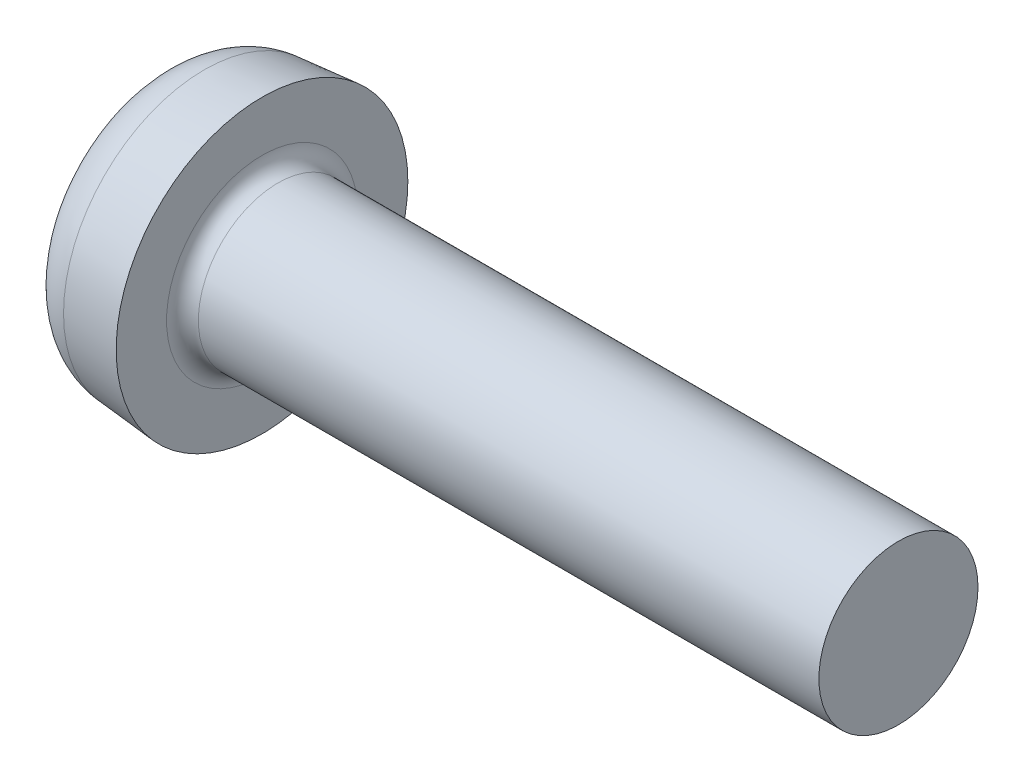
ISO-10303-21;
HEADER;
FILE_DESCRIPTION(('STEP AP214'),'2;1');
FILE_NAME('part.step','',(''),(''),'','','');
FILE_SCHEMA(('AUTOMOTIVE_DESIGN { 1 0 10303 214 1 1 1 1 }'));
ENDSEC;
DATA;
#1=APPLICATION_CONTEXT('core data for automotive mechanical design processes');
#2=APPLICATION_PROTOCOL_DEFINITION('international standard','automotive_design',2000,#1);
#3=PRODUCT_CONTEXT('',#1,'mechanical');
#4=PRODUCT('Part','Part','',(#3));
#5=PRODUCT_RELATED_PRODUCT_CATEGORY('part','',(#4));
#6=PRODUCT_DEFINITION_FORMATION('','',#4);
#7=PRODUCT_DEFINITION_CONTEXT('part definition',#1,'design');
#8=PRODUCT_DEFINITION('design','',#6,#7);
#9=PRODUCT_DEFINITION_SHAPE('','',#8);
#10=(LENGTH_UNIT() NAMED_UNIT(*) SI_UNIT(.MILLI.,.METRE.));
#11=(NAMED_UNIT(*) PLANE_ANGLE_UNIT() SI_UNIT($,.RADIAN.));
#12=(NAMED_UNIT(*) SI_UNIT($,.STERADIAN.) SOLID_ANGLE_UNIT());
#13=UNCERTAINTY_MEASURE_WITH_UNIT(LENGTH_MEASURE(1.E-05),#10,'distance_accuracy_value','');
#14=(GEOMETRIC_REPRESENTATION_CONTEXT(3) GLOBAL_UNCERTAINTY_ASSIGNED_CONTEXT((#13)) GLOBAL_UNIT_ASSIGNED_CONTEXT((#10,
#11,#12)) REPRESENTATION_CONTEXT('',''));
#15=CARTESIAN_POINT('',(0.,0.,0.));
#16=DIRECTION('',(0.,0.,1.));
#17=DIRECTION('',(1.,0.,0.));
#18=AXIS2_PLACEMENT_3D('',#15,#16,#17);
#19=CARTESIAN_POINT('',(0.,0.,0.));
#20=DIRECTION('',(-1.,0.,0.));
#21=DIRECTION('',(0.,0.,1.));
#22=AXIS2_PLACEMENT_3D('',#19,#20,#21);
#23=PLANE('',#22);
#24=DIRECTION('',(0.,1.,0.));
#25=VECTOR('',#24,1.);
#26=CARTESIAN_POINT('',(0.,0.35,-0.35));
#27=LINE('',#26,#25);
#28=CARTESIAN_POINT('',(0.,0.65,-0.35));
#29=VERTEX_POINT('',#28);
#30=CARTESIAN_POINT('',(0.,1.62134434609834,-0.35));
#31=VERTEX_POINT('',#30);
#32=EDGE_CURVE('E346',#29,#31,#27,.T.);
#33=ORIENTED_EDGE('',*,*,#32,.T.);
#34=CARTESIAN_POINT('',(0.,0.,0.));
#35=DIRECTION('',(-1.,0.,0.));
#36=DIRECTION('',(0.,0.,1.));
#37=AXIS2_PLACEMENT_3D('',#34,#35,#36);
#38=CIRCLE('',#37,1.65869149893072);
#39=CARTESIAN_POINT('',(0.,0.35,-1.62134434609834));
#40=VERTEX_POINT('',#39);
#41=EDGE_CURVE('E311',#31,#40,#38,.T.);
#42=ORIENTED_EDGE('',*,*,#41,.T.);
#43=DIRECTION('',(0.,0.,1.));
#44=VECTOR('',#43,1.);
#45=CARTESIAN_POINT('',(0.,0.35,-0.35));
#46=LINE('',#45,#44);
#47=CARTESIAN_POINT('',(0.,0.35,-0.65));
#48=VERTEX_POINT('',#47);
#49=EDGE_CURVE('E324',#40,#48,#46,.T.);
#50=ORIENTED_EDGE('',*,*,#49,.T.);
#51=CARTESIAN_POINT('',(0.,0.65,-0.65));
#52=DIRECTION('',(-1.,0.,0.));
#53=DIRECTION('',(0.,0.,1.));
#54=AXIS2_PLACEMENT_3D('',#51,#52,#53);
#55=CIRCLE('',#54,0.3);
#56=EDGE_CURVE('E373',#48,#29,#55,.T.);
#57=ORIENTED_EDGE('',*,*,#56,.T.);
#58=EDGE_LOOP('',(#33,#42,#50,#57));
#59=FACE_BOUND('',#58,.T.);
#60=ADVANCED_FACE('F41',(#59),#23,.T.);
#61=DIRECTION('',(0.,0.,-1.));
#62=VECTOR('',#61,1.);
#63=CARTESIAN_POINT('',(0.,-0.35,-0.35));
#64=LINE('',#63,#62);
#65=CARTESIAN_POINT('',(0.,-0.35,-0.65));
#66=VERTEX_POINT('',#65);
#67=CARTESIAN_POINT('',(0.,-0.35,-1.62134434609834));
#68=VERTEX_POINT('',#67);
#69=EDGE_CURVE('E339',#66,#68,#64,.T.);
#70=ORIENTED_EDGE('',*,*,#69,.T.);
#71=CARTESIAN_POINT('',(0.,0.,0.));
#72=DIRECTION('',(-1.,0.,0.));
#73=DIRECTION('',(0.,0.,1.));
#74=AXIS2_PLACEMENT_3D('',#71,#72,#73);
#75=CIRCLE('',#74,1.65869149893072);
#76=CARTESIAN_POINT('',(0.,-1.62134434609834,-0.35));
#77=VERTEX_POINT('',#76);
#78=EDGE_CURVE('E303',#68,#77,#75,.T.);
#79=ORIENTED_EDGE('',*,*,#78,.T.);
#80=DIRECTION('',(0.,1.,0.));
#81=VECTOR('',#80,1.);
#82=CARTESIAN_POINT('',(0.,-0.35,-0.35));
#83=LINE('',#82,#81);
#84=CARTESIAN_POINT('',(0.,-0.65,-0.35));
#85=VERTEX_POINT('',#84);
#86=EDGE_CURVE('E116',#77,#85,#83,.T.);
#87=ORIENTED_EDGE('',*,*,#86,.T.);
#88=CARTESIAN_POINT('',(0.,-0.65,-0.65));
#89=DIRECTION('',(-1.,0.,0.));
#90=DIRECTION('',(0.,0.,1.));
#91=AXIS2_PLACEMENT_3D('',#88,#89,#90);
#92=CIRCLE('',#91,0.3);
#93=EDGE_CURVE('E344',#85,#66,#92,.T.);
#94=ORIENTED_EDGE('',*,*,#93,.T.);
#95=EDGE_LOOP('',(#70,#79,#87,#94));
#96=FACE_BOUND('',#95,.T.);
#97=ADVANCED_FACE('F254',(#96),#23,.T.);
#98=DIRECTION('',(0.,-1.,0.));
#99=VECTOR('',#98,1.);
#100=CARTESIAN_POINT('',(0.,-0.35,0.35));
#101=LINE('',#100,#99);
#102=CARTESIAN_POINT('',(0.,-0.65,0.35));
#103=VERTEX_POINT('',#102);
#104=CARTESIAN_POINT('',(0.,-1.62134434609834,0.349999999999999));
#105=VERTEX_POINT('',#104);
#106=EDGE_CURVE('E348',#103,#105,#101,.T.);
#107=ORIENTED_EDGE('',*,*,#106,.T.);
#108=CARTESIAN_POINT('',(0.,0.,0.));
#109=DIRECTION('',(-1.,0.,0.));
#110=DIRECTION('',(0.,0.,1.));
#111=AXIS2_PLACEMENT_3D('',#108,#109,#110);
#112=CIRCLE('',#111,1.65869149893072);
#113=CARTESIAN_POINT('',(0.,-0.35,1.62134434609834));
#114=VERTEX_POINT('',#113);
#115=EDGE_CURVE('E299',#105,#114,#112,.T.);
#116=ORIENTED_EDGE('',*,*,#115,.T.);
#117=DIRECTION('',(0.,0.,-1.));
#118=VECTOR('',#117,1.);
#119=CARTESIAN_POINT('',(0.,-0.35,0.35));
#120=LINE('',#119,#118);
#121=CARTESIAN_POINT('',(0.,-0.35,0.65));
#122=VERTEX_POINT('',#121);
#123=EDGE_CURVE('E294',#114,#122,#120,.T.);
#124=ORIENTED_EDGE('',*,*,#123,.T.);
#125=CARTESIAN_POINT('',(0.,-0.65,0.65));
#126=DIRECTION('',(-1.,0.,0.));
#127=DIRECTION('',(0.,0.,1.));
#128=AXIS2_PLACEMENT_3D('',#125,#126,#127);
#129=CIRCLE('',#128,0.3);
#130=EDGE_CURVE('E378',#122,#103,#129,.T.);
#131=ORIENTED_EDGE('',*,*,#130,.T.);
#132=EDGE_LOOP('',(#107,#116,#124,#131));
#133=FACE_BOUND('',#132,.T.);
#134=ADVANCED_FACE('F261',(#133),#23,.T.);
#135=DIRECTION('',(0.,0.,1.));
#136=VECTOR('',#135,1.);
#137=CARTESIAN_POINT('',(0.,0.35,0.35));
#138=LINE('',#137,#136);
#139=CARTESIAN_POINT('',(0.,0.35,0.65));
#140=VERTEX_POINT('',#139);
#141=CARTESIAN_POINT('',(0.,0.35,1.62134434609834));
#142=VERTEX_POINT('',#141);
#143=EDGE_CURVE('E280',#140,#142,#138,.T.);
#144=ORIENTED_EDGE('',*,*,#143,.T.);
#145=CARTESIAN_POINT('',(0.,0.,0.));
#146=DIRECTION('',(-1.,0.,0.));
#147=DIRECTION('',(0.,0.,1.));
#148=AXIS2_PLACEMENT_3D('',#145,#146,#147);
#149=CIRCLE('',#148,1.65869149893072);
#150=CARTESIAN_POINT('',(0.,1.62134434609834,0.35));
#151=VERTEX_POINT('',#150);
#152=EDGE_CURVE('E284',#142,#151,#149,.T.);
#153=ORIENTED_EDGE('',*,*,#152,.T.);
#154=DIRECTION('',(0.,-1.,0.));
#155=VECTOR('',#154,1.);
#156=CARTESIAN_POINT('',(0.,0.35,0.35));
#157=LINE('',#156,#155);
#158=CARTESIAN_POINT('',(0.,0.65,0.35));
#159=VERTEX_POINT('',#158);
#160=EDGE_CURVE('E353',#151,#159,#157,.T.);
#161=ORIENTED_EDGE('',*,*,#160,.T.);
#162=CARTESIAN_POINT('',(0.,0.65,0.65));
#163=DIRECTION('',(-1.,0.,0.));
#164=DIRECTION('',(0.,0.,1.));
#165=AXIS2_PLACEMENT_3D('',#162,#163,#164);
#166=CIRCLE('',#165,0.3);
#167=EDGE_CURVE('E288',#159,#140,#166,.T.);
#168=ORIENTED_EDGE('',*,*,#167,.T.);
#169=EDGE_LOOP('',(#144,#153,#161,#168));
#170=FACE_BOUND('',#169,.T.);
#171=ADVANCED_FACE('F257',(#170),#23,.T.);
#172=CARTESIAN_POINT('',(14.,1.5,0.));
#173=DIRECTION('',(1.,0.,0.));
#174=DIRECTION('',(0.,0.,-1.));
#175=AXIS2_PLACEMENT_3D('',#172,#173,#174);
#176=PLANE('',#175);
#177=CARTESIAN_POINT('',(14.,0.,0.));
#178=DIRECTION('',(1.,0.,0.));
#179=DIRECTION('',(0.,0.,-1.));
#180=AXIS2_PLACEMENT_3D('',#177,#178,#179);
#181=CIRCLE('',#180,1.5);
#182=CARTESIAN_POINT('',(14.,0.,-1.5));
#183=VERTEX_POINT('',#182);
#184=EDGE_CURVE('E367',#183,#183,#181,.T.);
#185=ORIENTED_EDGE('',*,*,#184,.T.);
#186=EDGE_LOOP('',(#185));
#187=FACE_BOUND('',#186,.T.);
#188=ADVANCED_FACE('F266',(#187),#176,.T.);
#189=CARTESIAN_POINT('',(4.51581291088132,0.,0.));
#190=DIRECTION('',(1.,0.,0.));
#191=DIRECTION('',(0.,0.,-1.));
#192=AXIS2_PLACEMENT_3D('',#189,#190,#191);
#193=CYLINDRICAL_SURFACE('',#192,1.5);
#194=CARTESIAN_POINT('',(2.3,0.,0.));
#195=DIRECTION('',(1.,0.,0.));
#196=DIRECTION('',(0.,0.,-1.));
#197=AXIS2_PLACEMENT_3D('',#194,#195,#196);
#198=CIRCLE('',#197,1.5);
#199=CARTESIAN_POINT('',(2.3,0.,-1.5));
#200=VERTEX_POINT('',#199);
#201=EDGE_CURVE('E364',#200,#200,#198,.T.);
#202=ORIENTED_EDGE('',*,*,#201,.T.);
#203=EDGE_LOOP('',(#202));
#204=FACE_BOUND('',#203,.T.);
#205=ORIENTED_EDGE('',*,*,#184,.F.);
#206=EDGE_LOOP('',(#205));
#207=FACE_BOUND('',#206,.T.);
#208=ADVANCED_FACE('F272',(#204,#207),#193,.T.);
#209=CARTESIAN_POINT('',(2.3,0.,0.));
#210=DIRECTION('',(1.,0.,0.));
#211=DIRECTION('',(0.,0.,-1.));
#212=AXIS2_PLACEMENT_3D('',#209,#210,#211);
#213=TOROIDAL_SURFACE('',#212,1.8,0.3);
#214=CARTESIAN_POINT('',(2.,0.,0.));
#215=DIRECTION('',(1.,0.,0.));
#216=DIRECTION('',(0.,0.,-1.));
#217=AXIS2_PLACEMENT_3D('',#214,#215,#216);
#218=CIRCLE('',#217,1.8);
#219=CARTESIAN_POINT('',(2.,0.,-1.8));
#220=VERTEX_POINT('',#219);
#221=EDGE_CURVE('E360',#220,#220,#218,.T.);
#222=ORIENTED_EDGE('',*,*,#221,.T.);
#223=EDGE_LOOP('',(#222));
#224=FACE_BOUND('',#223,.T.);
#225=ORIENTED_EDGE('',*,*,#201,.F.);
#226=EDGE_LOOP('',(#225));
#227=FACE_BOUND('',#226,.T.);
#228=ADVANCED_FACE('F532',(#224,#227),#213,.F.);
#229=CARTESIAN_POINT('',(2.,1.8,0.));
#230=DIRECTION('',(1.,0.,0.));
#231=DIRECTION('',(0.,0.,-1.));
#232=AXIS2_PLACEMENT_3D('',#229,#230,#231);
#233=PLANE('',#232);
#234=CARTESIAN_POINT('',(2.,0.,0.));
#235=DIRECTION('',(1.,0.,0.));
#236=DIRECTION('',(0.,0.,-1.));
#237=AXIS2_PLACEMENT_3D('',#234,#235,#236);
#238=CIRCLE('',#237,2.75);
#239=CARTESIAN_POINT('',(2.,0.,-2.75));
#240=VERTEX_POINT('',#239);
#241=EDGE_CURVE('E356',#240,#240,#238,.T.);
#242=ORIENTED_EDGE('',*,*,#241,.T.);
#243=EDGE_LOOP('',(#242));
#244=FACE_BOUND('',#243,.T.);
#245=ORIENTED_EDGE('',*,*,#221,.F.);
#246=EDGE_LOOP('',(#245));
#247=FACE_BOUND('',#246,.T.);
#248=ADVANCED_FACE('F536',(#244,#247),#233,.T.);
#249=CARTESIAN_POINT('',(2.,0.,0.));
#250=DIRECTION('',(1.,0.,0.));
#251=DIRECTION('',(0.,0.,-1.));
#252=AXIS2_PLACEMENT_3D('',#249,#250,#251);
#253=CONICAL_SURFACE('',#252,2.75,0.0872664625997204);
#254=CARTESIAN_POINT('',(0.91284425725234,0.,0.));
#255=DIRECTION('',(-1.,0.,0.));
#256=DIRECTION('',(0.,0.,1.));
#257=AXIS2_PLACEMENT_3D('',#254,#255,#256);
#258=CIRCLE('',#257,2.65488619702247);
#259=CARTESIAN_POINT('',(0.91284425725234,0.,2.65488619702247));
#260=VERTEX_POINT('',#259);
#261=EDGE_CURVE('E300',#260,#260,#258,.F.);
#262=ORIENTED_EDGE('',*,*,#261,.T.);
#263=EDGE_LOOP('',(#262));
#264=FACE_BOUND('',#263,.T.);
#265=ORIENTED_EDGE('',*,*,#241,.F.);
#266=EDGE_LOOP('',(#265));
#267=FACE_BOUND('',#266,.T.);
#268=ADVANCED_FACE('F539',(#264,#267),#253,.T.);
#269=CARTESIAN_POINT('',(2.,0.35,0.35));
#270=DIRECTION('',(0.,-1.,0.));
#271=DIRECTION('',(0.,0.,-1.));
#272=AXIS2_PLACEMENT_3D('',#269,#270,#271);
#273=PLANE('',#272);
#274=DIRECTION('',(-0.939692620785908,0.,0.342020143325669));
#275=VECTOR('',#274,1.);
#276=CARTESIAN_POINT('',(0.,0.35,1.75));
#277=LINE('',#276,#275);
#278=CARTESIAN_POINT('',(2.,0.35,1.02205953146759));
#279=VERTEX_POINT('',#278);
#280=CARTESIAN_POINT('',(0.0076236649167392,0.35,1.74722521289429));
#281=VERTEX_POINT('',#280);
#282=EDGE_CURVE('E361',#279,#281,#277,.T.);
#283=ORIENTED_EDGE('',*,*,#282,.T.);
#284=CARTESIAN_POINT('',(0.00796535573110795,0.35,1.75));
#285=CARTESIAN_POINT('',(0.00530925160597728,0.35,1.72863961284289));
#286=CARTESIAN_POINT('',(0.00331741989986704,0.35,1.70723809914295));
#287=CARTESIAN_POINT('',(0.000662305181537985,0.35,1.66435288093683));
#288=CARTESIAN_POINT('',(-9.81689388264339E-07,0.35,1.64286917666955));
#289=CARTESIAN_POINT('',(0.,0.35,1.62134434609834));
#290=B_SPLINE_CURVE_WITH_KNOTS('',3,(#284,#285,#286,#287,#288,#289),.UNSPECIFIED.,.F.,.F.,(4,2,
4),(0.,0.0644820102024402,0.128963833119088),.UNSPECIFIED.);
#291=EDGE_CURVE('E191',#281,#142,#290,.T.);
#292=ORIENTED_EDGE('',*,*,#291,.T.);
#293=ORIENTED_EDGE('',*,*,#143,.F.);
#294=DIRECTION('',(-1.,0.,0.));
#295=VECTOR('',#294,1.);
#296=CARTESIAN_POINT('',(2.,0.35,0.65));
#297=LINE('',#296,#295);
#298=CARTESIAN_POINT('',(2.,0.35,0.65));
#299=VERTEX_POINT('',#298);
#300=EDGE_CURVE('E391',#140,#299,#297,.F.);
#301=ORIENTED_EDGE('',*,*,#300,.T.);
#302=DIRECTION('',(0.,0.,1.));
#303=VECTOR('',#302,1.);
#304=CARTESIAN_POINT('',(2.,0.35,0.35));
#305=LINE('',#304,#303);
#306=EDGE_CURVE('E355',#299,#279,#305,.T.);
#307=ORIENTED_EDGE('',*,*,#306,.T.);
#308=EDGE_LOOP('',(#283,#292,#293,#301,#307));
#309=FACE_BOUND('',#308,.T.);
#310=ADVANCED_FACE('F446',(#309),#273,.T.);
#311=CARTESIAN_POINT('',(0.,0.,1.75));
#312=DIRECTION('',(-0.342020143325669,0.,-0.939692620785908));
#313=DIRECTION('',(-0.939692620785908,0.,0.342020143325669));
#314=AXIS2_PLACEMENT_3D('',#311,#312,#313);
#315=PLANE('',#314);
#316=DIRECTION('',(-0.939692620785908,0.,0.342020143325669));
#317=VECTOR('',#316,1.);
#318=CARTESIAN_POINT('',(2.21599576989956,-0.35,0.943443500496743));
#319=LINE('',#318,#317);
#320=CARTESIAN_POINT('',(2.,-0.35,1.02205953146759));
#321=VERTEX_POINT('',#320);
#322=CARTESIAN_POINT('',(0.00762366491673975,-0.35,1.74722521289429));
#323=VERTEX_POINT('',#322);
#324=EDGE_CURVE('E442',#321,#323,#319,.T.);
#325=ORIENTED_EDGE('',*,*,#324,.T.);
#326=CARTESIAN_POINT('',(0.00762366491673975,-0.35,1.74722521289429));
#327=CARTESIAN_POINT('',(0.00630099140167024,-0.291673398723648,1.74770662668342));
#328=CARTESIAN_POINT('',(0.00540592205497323,-0.233339136124059,1.74803240528323));
#329=CARTESIAN_POINT('',(0.00427721541103728,-0.11666991507326,1.74844322090484));
#330=CARTESIAN_POINT('',(0.00404349915785196,-0.0583349575366301,1.74852828666426));
#331=CARTESIAN_POINT('',(0.00404349915785196,0.0583349575366294,1.74852828666426));
#332=CARTESIAN_POINT('',(0.00427721541103728,0.116669915073259,1.74844322090484));
#333=CARTESIAN_POINT('',(0.00540592205497322,0.233339136124058,1.74803240528323));
#334=CARTESIAN_POINT('',(0.00630099140167022,0.291673398723647,1.74770662668342));
#335=CARTESIAN_POINT('',(0.00762366491673973,0.35,1.74722521289429));
#336=B_SPLINE_CURVE_WITH_KNOTS('',3,(#326,#327,#328,#329,#330,#331,#332,#333,#334,#335),
.UNSPECIFIED.,.F.,.F.,(4,2,2,2,4),(0.,0.17502399992484,0.350027103646371,0.525030207367903,
0.700054207292742),.UNSPECIFIED.);
#337=EDGE_CURVE('E139',#323,#281,#336,.T.);
#338=ORIENTED_EDGE('',*,*,#337,.T.);
#339=ORIENTED_EDGE('',*,*,#282,.F.);
#340=DIRECTION('',(0.,-1.,0.));
#341=VECTOR('',#340,1.);
#342=CARTESIAN_POINT('',(2.,0.,1.02205953146759));
#343=LINE('',#342,#341);
#344=EDGE_CURVE('E449',#279,#321,#343,.T.);
#345=ORIENTED_EDGE('',*,*,#344,.T.);
#346=EDGE_LOOP('',(#325,#338,#339,#345));
#347=FACE_BOUND('',#346,.T.);
#348=ADVANCED_FACE('F169',(#347),#315,.T.);
#349=CARTESIAN_POINT('',(2.,-0.35,0.35));
#350=DIRECTION('',(0.,1.,0.));
#351=DIRECTION('',(0.,0.,1.));
#352=AXIS2_PLACEMENT_3D('',#349,#350,#351);
#353=PLANE('',#352);
#354=ORIENTED_EDGE('',*,*,#123,.F.);
#355=CARTESIAN_POINT('',(0.,-0.35,1.62134434609834));
#356=CARTESIAN_POINT('',(-9.81689387196558E-07,-0.35,1.64286917666955));
#357=CARTESIAN_POINT('',(0.000662305181538556,-0.35,1.66435288093683));
#358=CARTESIAN_POINT('',(0.00331741989986648,-0.35,1.70723809914295));
#359=CARTESIAN_POINT('',(0.00530925160597608,-0.35,1.72863961284289));
#360=CARTESIAN_POINT('',(0.00796535573110604,-0.35,1.75));
#361=B_SPLINE_CURVE_WITH_KNOTS('',3,(#355,#356,#357,#358,#359,#360),.UNSPECIFIED.,.F.,.F.,(4,2,
4),(0.,0.0644818229166478,0.128963833119088),.UNSPECIFIED.);
#362=EDGE_CURVE('E133',#114,#323,#361,.T.);
#363=ORIENTED_EDGE('',*,*,#362,.T.);
#364=ORIENTED_EDGE('',*,*,#324,.F.);
#365=DIRECTION('',(0.,0.,-1.));
#366=VECTOR('',#365,1.);
#367=CARTESIAN_POINT('',(2.,-0.35,0.35));
#368=LINE('',#367,#366);
#369=CARTESIAN_POINT('',(2.,-0.35,0.65));
#370=VERTEX_POINT('',#369);
#371=EDGE_CURVE('E450',#321,#370,#368,.T.);
#372=ORIENTED_EDGE('',*,*,#371,.T.);
#373=DIRECTION('',(-1.,0.,0.));
#374=VECTOR('',#373,1.);
#375=CARTESIAN_POINT('',(2.,-0.35,0.65));
#376=LINE('',#375,#374);
#377=EDGE_CURVE('E370',#370,#122,#376,.T.);
#378=ORIENTED_EDGE('',*,*,#377,.T.);
#379=EDGE_LOOP('',(#354,#363,#364,#372,#378));
#380=FACE_BOUND('',#379,.T.);
#381=ADVANCED_FACE('F476',(#380),#353,.T.);
#382=CARTESIAN_POINT('',(2.,-0.35,0.35));
#383=DIRECTION('',(0.,0.,-1.));
#384=DIRECTION('',(0.,1.,0.));
#385=AXIS2_PLACEMENT_3D('',#382,#383,#384);
#386=PLANE('',#385);
#387=DIRECTION('',(-0.939692620785908,-0.342020143325669,0.));
#388=VECTOR('',#387,1.);
#389=CARTESIAN_POINT('',(0.,-1.75,0.349999999999999));
#390=LINE('',#389,#388);
#391=CARTESIAN_POINT('',(2.,-1.02205953146759,0.349999999999999));
#392=VERTEX_POINT('',#391);
#393=CARTESIAN_POINT('',(0.0076236649167392,-1.74722521289429,0.349999999999999));
#394=VERTEX_POINT('',#393);
#395=EDGE_CURVE('E123',#392,#394,#390,.T.);
#396=ORIENTED_EDGE('',*,*,#395,.T.);
#397=CARTESIAN_POINT('',(0.00796535573110795,-1.75,0.349999999999999));
#398=CARTESIAN_POINT('',(0.00530925160597725,-1.72863961284289,0.349999999999999));
#399=CARTESIAN_POINT('',(0.00331741989986698,-1.70723809914295,0.349999999999999));
#400=CARTESIAN_POINT('',(0.000662305181537863,-1.66435288093683,0.349999999999999));
#401=CARTESIAN_POINT('',(-9.81689388417754E-07,-1.64286917666955,0.349999999999999));
#402=CARTESIAN_POINT('',(0.,-1.62134434609834,0.349999999999999));
#403=B_SPLINE_CURVE_WITH_KNOTS('',3,(#397,#398,#399,#400,#401,#402),.UNSPECIFIED.,.F.,.F.,(4,2,
4),(0.,0.0644820102024402,0.128963833119088),.UNSPECIFIED.);
#404=EDGE_CURVE('E132',#394,#105,#403,.T.);
#405=ORIENTED_EDGE('',*,*,#404,.T.);
#406=ORIENTED_EDGE('',*,*,#106,.F.);
#407=DIRECTION('',(-1.,0.,0.));
#408=VECTOR('',#407,1.);
#409=CARTESIAN_POINT('',(2.,-0.65,0.35));
#410=LINE('',#409,#408);
#411=CARTESIAN_POINT('',(2.,-0.65,0.35));
#412=VERTEX_POINT('',#411);
#413=EDGE_CURVE('E381',#103,#412,#410,.F.);
#414=ORIENTED_EDGE('',*,*,#413,.T.);
#415=DIRECTION('',(0.,-1.,0.));
#416=VECTOR('',#415,1.);
#417=CARTESIAN_POINT('',(2.,-0.35,0.35));
#418=LINE('',#417,#416);
#419=EDGE_CURVE('E452',#412,#392,#418,.T.);
#420=ORIENTED_EDGE('',*,*,#419,.T.);
#421=EDGE_LOOP('',(#396,#405,#406,#414,#420));
#422=FACE_BOUND('',#421,.T.);
#423=ADVANCED_FACE('F160',(#422),#386,.T.);
#424=CARTESIAN_POINT('',(0.,-1.75,0.));
#425=DIRECTION('',(-0.342020143325669,0.939692620785908,0.));
#426=DIRECTION('',(-0.939692620785908,-0.342020143325669,0.));
#427=AXIS2_PLACEMENT_3D('',#424,#425,#426);
#428=PLANE('',#427);
#429=DIRECTION('',(-0.939692620785908,-0.342020143325669,0.));
#430=VECTOR('',#429,1.);
#431=CARTESIAN_POINT('',(2.21599576989956,-0.943443500496743,-0.35));
#432=LINE('',#431,#430);
#433=CARTESIAN_POINT('',(2.,-1.02205953146759,-0.35));
#434=VERTEX_POINT('',#433);
#435=CARTESIAN_POINT('',(0.00762366491673973,-1.74722521289429,-0.35));
#436=VERTEX_POINT('',#435);
#437=EDGE_CURVE('E111',#434,#436,#432,.T.);
#438=ORIENTED_EDGE('',*,*,#437,.T.);
#439=CARTESIAN_POINT('',(0.00762366491673973,-1.74722521289429,-0.35));
#440=CARTESIAN_POINT('',(0.00630099140167022,-1.74770662668342,-0.291673398723648));
#441=CARTESIAN_POINT('',(0.00540592205497322,-1.74803240528323,-0.233339136124059));
#442=CARTESIAN_POINT('',(0.00427721541103728,-1.74844322090484,-0.11666991507326));
#443=CARTESIAN_POINT('',(0.00404349915785196,-1.74852828666426,-0.05833495753663));
#444=CARTESIAN_POINT('',(0.00404349915785196,-1.74852828666426,0.0583349575366293));
#445=CARTESIAN_POINT('',(0.00427721541103728,-1.74844322090484,0.116669915073259));
#446=CARTESIAN_POINT('',(0.00540592205497323,-1.74803240528323,0.233339136124058));
#447=CARTESIAN_POINT('',(0.00630099140167023,-1.74770662668342,0.291673398723647));
#448=CARTESIAN_POINT('',(0.00762366491673975,-1.74722521289429,0.349999999999999));
#449=B_SPLINE_CURVE_WITH_KNOTS('',3,(#439,#440,#441,#442,#443,#444,#445,#446,#447,#448),
.UNSPECIFIED.,.F.,.F.,(4,2,2,2,4),(0.,0.17502399992484,0.350027103646371,0.525030207367903,
0.700054207292742),.UNSPECIFIED.);
#450=EDGE_CURVE('E46',#436,#394,#449,.T.);
#451=ORIENTED_EDGE('',*,*,#450,.T.);
#452=ORIENTED_EDGE('',*,*,#395,.F.);
#453=DIRECTION('',(0.,0.,-1.));
#454=VECTOR('',#453,1.);
#455=CARTESIAN_POINT('',(2.,-1.02205953146759,0.));
#456=LINE('',#455,#454);
#457=EDGE_CURVE('E122',#392,#434,#456,.T.);
#458=ORIENTED_EDGE('',*,*,#457,.T.);
#459=EDGE_LOOP('',(#438,#451,#452,#458));
#460=FACE_BOUND('',#459,.T.);
#461=ADVANCED_FACE('F43',(#460),#428,.T.);
#462=CARTESIAN_POINT('',(2.,-0.35,-0.35));
#463=DIRECTION('',(0.,0.,1.));
#464=DIRECTION('',(1.,0.,0.));
#465=AXIS2_PLACEMENT_3D('',#462,#463,#464);
#466=PLANE('',#465);
#467=ORIENTED_EDGE('',*,*,#86,.F.);
#468=CARTESIAN_POINT('',(0.,-1.62134434609834,-0.35));
#469=CARTESIAN_POINT('',(-9.81689387200585E-07,-1.64286917666955,-0.35));
#470=CARTESIAN_POINT('',(0.000662305181538548,-1.66435288093683,-0.35));
#471=CARTESIAN_POINT('',(0.00331741989986647,-1.70723809914295,-0.35));
#472=CARTESIAN_POINT('',(0.00530925160597605,-1.72863961284289,-0.35));
#473=CARTESIAN_POINT('',(0.00796535573110601,-1.75,-0.35));
#474=B_SPLINE_CURVE_WITH_KNOTS('',3,(#468,#469,#470,#471,#472,#473),.UNSPECIFIED.,.F.,.F.,(4,2,
4),(0.,0.0644818229166478,0.128963833119088),.UNSPECIFIED.);
#475=EDGE_CURVE('E108',#77,#436,#474,.T.);
#476=ORIENTED_EDGE('',*,*,#475,.T.);
#477=ORIENTED_EDGE('',*,*,#437,.F.);
#478=DIRECTION('',(0.,1.,0.));
#479=VECTOR('',#478,1.);
#480=CARTESIAN_POINT('',(2.,-0.35,-0.35));
#481=LINE('',#480,#479);
#482=CARTESIAN_POINT('',(2.,-0.65,-0.35));
#483=VERTEX_POINT('',#482);
#484=EDGE_CURVE('E457',#434,#483,#481,.T.);
#485=ORIENTED_EDGE('',*,*,#484,.T.);
#486=DIRECTION('',(-1.,0.,0.));
#487=VECTOR('',#486,1.);
#488=CARTESIAN_POINT('',(2.,-0.65,-0.35));
#489=LINE('',#488,#487);
#490=EDGE_CURVE('E384',#483,#85,#489,.T.);
#491=ORIENTED_EDGE('',*,*,#490,.T.);
#492=EDGE_LOOP('',(#467,#476,#477,#485,#491));
#493=FACE_BOUND('',#492,.T.);
#494=ADVANCED_FACE('F109',(#493),#466,.T.);
#495=CARTESIAN_POINT('',(2.,-0.35,-0.35));
#496=DIRECTION('',(0.,1.,0.));
#497=DIRECTION('',(0.,0.,1.));
#498=AXIS2_PLACEMENT_3D('',#495,#496,#497);
#499=PLANE('',#498);
#500=DIRECTION('',(-0.939692620785908,0.,-0.342020143325669));
#501=VECTOR('',#500,1.);
#502=CARTESIAN_POINT('',(0.,-0.35,-1.75));
#503=LINE('',#502,#501);
#504=CARTESIAN_POINT('',(2.,-0.35,-1.02205953146759));
#505=VERTEX_POINT('',#504);
#506=CARTESIAN_POINT('',(0.0076236649167392,-0.35,-1.74722521289429));
#507=VERTEX_POINT('',#506);
#508=EDGE_CURVE('E124',#505,#507,#503,.T.);
#509=ORIENTED_EDGE('',*,*,#508,.T.);
#510=CARTESIAN_POINT('',(0.00796535573110795,-0.35,-1.75));
#511=CARTESIAN_POINT('',(0.00530925160597726,-0.35,-1.72863961284289));
#512=CARTESIAN_POINT('',(0.00331741989986701,-0.35,-1.70723809914295));
#513=CARTESIAN_POINT('',(0.000662305181537913,-0.35,-1.66435288093683));
#514=CARTESIAN_POINT('',(-9.81689388354343E-07,-0.35,-1.64286917666955));
#515=CARTESIAN_POINT('',(0.,-0.35,-1.62134434609834));
#516=B_SPLINE_CURVE_WITH_KNOTS('',3,(#510,#511,#512,#513,#514,#515),.UNSPECIFIED.,.F.,.F.,(4,2,
4),(0.,0.0644820102024404,0.128963833119088),.UNSPECIFIED.);
#517=EDGE_CURVE('E119',#507,#68,#516,.T.);
#518=ORIENTED_EDGE('',*,*,#517,.T.);
#519=ORIENTED_EDGE('',*,*,#69,.F.);
#520=DIRECTION('',(-1.,0.,0.));
#521=VECTOR('',#520,1.);
#522=CARTESIAN_POINT('',(2.,-0.35,-0.65));
#523=LINE('',#522,#521);
#524=CARTESIAN_POINT('',(2.,-0.35,-0.65));
#525=VERTEX_POINT('',#524);
#526=EDGE_CURVE('E386',#66,#525,#523,.F.);
#527=ORIENTED_EDGE('',*,*,#526,.T.);
#528=DIRECTION('',(0.,0.,-1.));
#529=VECTOR('',#528,1.);
#530=CARTESIAN_POINT('',(2.,-0.35,-0.35));
#531=LINE('',#530,#529);
#532=EDGE_CURVE('E459',#525,#505,#531,.T.);
#533=ORIENTED_EDGE('',*,*,#532,.T.);
#534=EDGE_LOOP('',(#509,#518,#519,#527,#533));
#535=FACE_BOUND('',#534,.T.);
#536=ADVANCED_FACE('F239',(#535),#499,.T.);
#537=CARTESIAN_POINT('',(0.,0.,-1.75));
#538=DIRECTION('',(-0.342020143325669,0.,0.939692620785908));
#539=DIRECTION('',(0.939692620785908,0.,0.342020143325669));
#540=AXIS2_PLACEMENT_3D('',#537,#538,#539);
#541=PLANE('',#540);
#542=DIRECTION('',(-0.939692620785908,0.,-0.342020143325669));
#543=VECTOR('',#542,1.);
#544=CARTESIAN_POINT('',(2.21599576989956,0.35,-0.943443500496744));
#545=LINE('',#544,#543);
#546=CARTESIAN_POINT('',(2.,0.35,-1.02205953146759));
#547=VERTEX_POINT('',#546);
#548=CARTESIAN_POINT('',(0.00762366491673967,0.35,-1.74722521289429));
#549=VERTEX_POINT('',#548);
#550=EDGE_CURVE('E321',#547,#549,#545,.T.);
#551=ORIENTED_EDGE('',*,*,#550,.T.);
#552=CARTESIAN_POINT('',(0.00762366491673967,0.35,-1.74722521289429));
#553=CARTESIAN_POINT('',(0.00630099140167049,0.291673398723648,-1.74770662668342));
#554=CARTESIAN_POINT('',(0.00540592205497347,0.233339136124058,-1.74803240528323));
#555=CARTESIAN_POINT('',(0.00427721541103733,0.116669915073259,-1.74844322090484));
#556=CARTESIAN_POINT('',(0.00404349915785185,0.0583349575366296,-1.74852828666426));
#557=CARTESIAN_POINT('',(0.00404349915785194,-0.0583349575366298,-1.74852828666426));
#558=CARTESIAN_POINT('',(0.00427721541103752,-0.11666991507326,-1.74844322090484));
#559=CARTESIAN_POINT('',(0.00540592205497369,-0.233339136124059,-1.74803240528323));
#560=CARTESIAN_POINT('',(0.00630099140167067,-0.291673398723648,-1.74770662668342));
#561=CARTESIAN_POINT('',(0.00762366491673966,-0.35,-1.74722521289429));
#562=B_SPLINE_CURVE_WITH_KNOTS('',3,(#552,#553,#554,#555,#556,#557,#558,#559,#560,#561),
.UNSPECIFIED.,.F.,.F.,(4,2,2,2,4),(0.,0.17502399992484,0.350027103646371,0.525030207367903,
0.700054207292742),.UNSPECIFIED.);
#563=EDGE_CURVE('E227',#549,#507,#562,.T.);
#564=ORIENTED_EDGE('',*,*,#563,.T.);
#565=ORIENTED_EDGE('',*,*,#508,.F.);
#566=DIRECTION('',(0.,1.,0.));
#567=VECTOR('',#566,1.);
#568=CARTESIAN_POINT('',(2.,0.,-1.02205953146759));
#569=LINE('',#568,#567);
#570=EDGE_CURVE('E329',#505,#547,#569,.T.);
#571=ORIENTED_EDGE('',*,*,#570,.T.);
#572=EDGE_LOOP('',(#551,#564,#565,#571));
#573=FACE_BOUND('',#572,.T.);
#574=ADVANCED_FACE('F235',(#573),#541,.T.);
#575=CARTESIAN_POINT('',(2.,0.35,-0.35));
#576=DIRECTION('',(0.,-1.,0.));
#577=DIRECTION('',(0.,0.,-1.));
#578=AXIS2_PLACEMENT_3D('',#575,#576,#577);
#579=PLANE('',#578);
#580=ORIENTED_EDGE('',*,*,#49,.F.);
#581=CARTESIAN_POINT('',(0.,0.35,-1.62134434609834));
#582=CARTESIAN_POINT('',(-9.81689387191561E-07,0.35,-1.64286917666955));
#583=CARTESIAN_POINT('',(0.000662305181538557,0.35,-1.66435288093683));
#584=CARTESIAN_POINT('',(0.00331741989986647,0.35,-1.70723809914295));
#585=CARTESIAN_POINT('',(0.00530925160597605,0.35,-1.72863961284289));
#586=CARTESIAN_POINT('',(0.00796535573110601,0.35,-1.75));
#587=B_SPLINE_CURVE_WITH_KNOTS('',3,(#581,#582,#583,#584,#585,#586),.UNSPECIFIED.,.F.,.F.,(4,2,
4),(0.,0.0644818229166478,0.128963833119088),.UNSPECIFIED.);
#588=EDGE_CURVE('E147',#40,#549,#587,.T.);
#589=ORIENTED_EDGE('',*,*,#588,.T.);
#590=ORIENTED_EDGE('',*,*,#550,.F.);
#591=DIRECTION('',(0.,0.,1.));
#592=VECTOR('',#591,1.);
#593=CARTESIAN_POINT('',(2.,0.35,-0.35));
#594=LINE('',#593,#592);
#595=CARTESIAN_POINT('',(2.,0.35,-0.65));
#596=VERTEX_POINT('',#595);
#597=EDGE_CURVE('E412',#547,#596,#594,.T.);
#598=ORIENTED_EDGE('',*,*,#597,.T.);
#599=DIRECTION('',(-1.,0.,0.));
#600=VECTOR('',#599,1.);
#601=CARTESIAN_POINT('',(2.,0.35,-0.65));
#602=LINE('',#601,#600);
#603=EDGE_CURVE('E393',#596,#48,#602,.T.);
#604=ORIENTED_EDGE('',*,*,#603,.T.);
#605=EDGE_LOOP('',(#580,#589,#590,#598,#604));
#606=FACE_BOUND('',#605,.T.);
#607=ADVANCED_FACE('F238',(#606),#579,.T.);
#608=CARTESIAN_POINT('',(2.,0.35,-0.35));
#609=DIRECTION('',(0.,0.,1.));
#610=DIRECTION('',(1.,0.,0.));
#611=AXIS2_PLACEMENT_3D('',#608,#609,#610);
#612=PLANE('',#611);
#613=DIRECTION('',(-0.939692620785908,0.342020143325669,0.));
#614=VECTOR('',#613,1.);
#615=CARTESIAN_POINT('',(0.,1.75,-0.35));
#616=LINE('',#615,#614);
#617=CARTESIAN_POINT('',(2.,1.02205953146759,-0.35));
#618=VERTEX_POINT('',#617);
#619=CARTESIAN_POINT('',(0.0076236649167392,1.74722521289429,-0.35));
#620=VERTEX_POINT('',#619);
#621=EDGE_CURVE('E330',#618,#620,#616,.T.);
#622=ORIENTED_EDGE('',*,*,#621,.T.);
#623=CARTESIAN_POINT('',(0.00796535573110795,1.75,-0.35));
#624=CARTESIAN_POINT('',(0.00530925160597727,1.72863961284289,-0.35));
#625=CARTESIAN_POINT('',(0.00331741989986703,1.70723809914295,-0.35));
#626=CARTESIAN_POINT('',(0.000662305181537968,1.66435288093683,-0.35));
#627=CARTESIAN_POINT('',(-9.81689388286745E-07,1.64286917666955,-0.35));
#628=CARTESIAN_POINT('',(0.,1.62134434609834,-0.35));
#629=B_SPLINE_CURVE_WITH_KNOTS('',3,(#623,#624,#625,#626,#627,#628),.UNSPECIFIED.,.F.,.F.,(4,2,
4),(0.,0.0644820102024402,0.128963833119088),.UNSPECIFIED.);
#630=EDGE_CURVE('E11',#620,#31,#629,.T.);
#631=ORIENTED_EDGE('',*,*,#630,.T.);
#632=ORIENTED_EDGE('',*,*,#32,.F.);
#633=DIRECTION('',(-1.,0.,0.));
#634=VECTOR('',#633,1.);
#635=CARTESIAN_POINT('',(2.,0.65,-0.35));
#636=LINE('',#635,#634);
#637=CARTESIAN_POINT('',(2.,0.65,-0.35));
#638=VERTEX_POINT('',#637);
#639=EDGE_CURVE('E395',#29,#638,#636,.F.);
#640=ORIENTED_EDGE('',*,*,#639,.T.);
#641=DIRECTION('',(0.,1.,0.));
#642=VECTOR('',#641,1.);
#643=CARTESIAN_POINT('',(2.,0.35,-0.35));
#644=LINE('',#643,#642);
#645=EDGE_CURVE('E416',#638,#618,#644,.T.);
#646=ORIENTED_EDGE('',*,*,#645,.T.);
#647=EDGE_LOOP('',(#622,#631,#632,#640,#646));
#648=FACE_BOUND('',#647,.T.);
#649=ADVANCED_FACE('F245',(#648),#612,.T.);
#650=CARTESIAN_POINT('',(0.,1.75,0.));
#651=DIRECTION('',(-0.342020143325669,-0.939692620785908,0.));
#652=DIRECTION('',(0.939692620785908,-0.342020143325669,0.));
#653=AXIS2_PLACEMENT_3D('',#650,#651,#652);
#654=PLANE('',#653);
#655=DIRECTION('',(-0.939692620785908,0.342020143325669,0.));
#656=VECTOR('',#655,1.);
#657=CARTESIAN_POINT('',(2.21599576989956,0.943443500496743,0.35));
#658=LINE('',#657,#656);
#659=CARTESIAN_POINT('',(2.,1.02205953146759,0.35));
#660=VERTEX_POINT('',#659);
#661=CARTESIAN_POINT('',(0.00762366491673975,1.74722521289429,0.35));
#662=VERTEX_POINT('',#661);
#663=EDGE_CURVE('E465',#660,#662,#658,.T.);
#664=ORIENTED_EDGE('',*,*,#663,.T.);
#665=CARTESIAN_POINT('',(0.00762366491673975,1.74722521289429,0.35));
#666=CARTESIAN_POINT('',(0.00630099140167024,1.74770662668342,0.291673398723648));
#667=CARTESIAN_POINT('',(0.00540592205497323,1.74803240528323,0.233339136124059));
#668=CARTESIAN_POINT('',(0.00427721541103729,1.74844322090484,0.116669915073259));
#669=CARTESIAN_POINT('',(0.00404349915785197,1.74852828666426,0.0583349575366296));
#670=CARTESIAN_POINT('',(0.00404349915785197,1.74852828666426,-0.0583349575366298));
#671=CARTESIAN_POINT('',(0.00427721541103729,1.74844322090484,-0.11666991507326));
#672=CARTESIAN_POINT('',(0.00540592205497324,1.74803240528323,-0.233339136124059));
#673=CARTESIAN_POINT('',(0.00630099140167024,1.74770662668342,-0.291673398723648));
#674=CARTESIAN_POINT('',(0.00762366491673975,1.74722521289429,-0.35));
#675=B_SPLINE_CURVE_WITH_KNOTS('',3,(#665,#666,#667,#668,#669,#670,#671,#672,#673,#674),
.UNSPECIFIED.,.F.,.F.,(4,2,2,2,4),(0.,0.17502399992484,0.350027103646371,0.525030207367903,
0.700054207292743),.UNSPECIFIED.);
#676=EDGE_CURVE('E57',#662,#620,#675,.T.);
#677=ORIENTED_EDGE('',*,*,#676,.T.);
#678=ORIENTED_EDGE('',*,*,#621,.F.);
#679=DIRECTION('',(0.,0.,1.));
#680=VECTOR('',#679,1.);
#681=CARTESIAN_POINT('',(2.,1.02205953146759,0.));
#682=LINE('',#681,#680);
#683=EDGE_CURVE('E462',#618,#660,#682,.T.);
#684=ORIENTED_EDGE('',*,*,#683,.T.);
#685=EDGE_LOOP('',(#664,#677,#678,#684));
#686=FACE_BOUND('',#685,.T.);
#687=ADVANCED_FACE('F241',(#686),#654,.T.);
#688=CARTESIAN_POINT('',(2.,0.35,0.35));
#689=DIRECTION('',(0.,0.,-1.));
#690=DIRECTION('',(0.,1.,0.));
#691=AXIS2_PLACEMENT_3D('',#688,#689,#690);
#692=PLANE('',#691);
#693=ORIENTED_EDGE('',*,*,#160,.F.);
#694=CARTESIAN_POINT('',(0.,1.62134434609834,0.35));
#695=CARTESIAN_POINT('',(-9.81689387192155E-07,1.64286917666955,0.35));
#696=CARTESIAN_POINT('',(0.000662305181538561,1.66435288093683,0.35));
#697=CARTESIAN_POINT('',(0.00331741989986648,1.70723809914295,0.35));
#698=CARTESIAN_POINT('',(0.00530925160597608,1.72863961284289,0.35));
#699=CARTESIAN_POINT('',(0.00796535573110604,1.75,0.35));
#700=B_SPLINE_CURVE_WITH_KNOTS('',3,(#694,#695,#696,#697,#698,#699),.UNSPECIFIED.,.F.,.F.,(4,2,
4),(0.,0.0644818229166476,0.128963833119088),.UNSPECIFIED.);
#701=EDGE_CURVE('E199',#151,#662,#700,.T.);
#702=ORIENTED_EDGE('',*,*,#701,.T.);
#703=ORIENTED_EDGE('',*,*,#663,.F.);
#704=DIRECTION('',(0.,-1.,0.));
#705=VECTOR('',#704,1.);
#706=CARTESIAN_POINT('',(2.,0.35,0.35));
#707=LINE('',#706,#705);
#708=CARTESIAN_POINT('',(2.,0.65,0.35));
#709=VERTEX_POINT('',#708);
#710=EDGE_CURVE('E463',#660,#709,#707,.T.);
#711=ORIENTED_EDGE('',*,*,#710,.T.);
#712=DIRECTION('',(-1.,0.,0.));
#713=VECTOR('',#712,1.);
#714=CARTESIAN_POINT('',(2.,0.65,0.35));
#715=LINE('',#714,#713);
#716=EDGE_CURVE('E388',#709,#159,#715,.T.);
#717=ORIENTED_EDGE('',*,*,#716,.T.);
#718=EDGE_LOOP('',(#693,#702,#703,#711,#717));
#719=FACE_BOUND('',#718,.T.);
#720=ADVANCED_FACE('F244',(#719),#692,.T.);
#721=CARTESIAN_POINT('',(2.,0.35,0.35));
#722=DIRECTION('',(1.,0.,0.));
#723=DIRECTION('',(0.,0.,-1.));
#724=AXIS2_PLACEMENT_3D('',#721,#722,#723);
#725=PLANE('',#724);
#726=ORIENTED_EDGE('',*,*,#306,.F.);
#727=CARTESIAN_POINT('',(2.,0.65,0.65));
#728=DIRECTION('',(1.,0.,0.));
#729=DIRECTION('',(0.,0.,-1.));
#730=AXIS2_PLACEMENT_3D('',#727,#728,#729);
#731=CIRCLE('',#730,0.3);
#732=EDGE_CURVE('E404',#299,#709,#731,.T.);
#733=ORIENTED_EDGE('',*,*,#732,.T.);
#734=ORIENTED_EDGE('',*,*,#710,.F.);
#735=ORIENTED_EDGE('',*,*,#683,.F.);
#736=ORIENTED_EDGE('',*,*,#645,.F.);
#737=CARTESIAN_POINT('',(2.,0.65,-0.65));
#738=DIRECTION('',(1.,0.,0.));
#739=DIRECTION('',(0.,0.,-1.));
#740=AXIS2_PLACEMENT_3D('',#737,#738,#739);
#741=CIRCLE('',#740,0.3);
#742=EDGE_CURVE('E306',#638,#596,#741,.T.);
#743=ORIENTED_EDGE('',*,*,#742,.T.);
#744=ORIENTED_EDGE('',*,*,#597,.F.);
#745=ORIENTED_EDGE('',*,*,#570,.F.);
#746=ORIENTED_EDGE('',*,*,#532,.F.);
#747=CARTESIAN_POINT('',(2.,-0.65,-0.65));
#748=DIRECTION('',(1.,0.,0.));
#749=DIRECTION('',(0.,0.,-1.));
#750=AXIS2_PLACEMENT_3D('',#747,#748,#749);
#751=CIRCLE('',#750,0.3);
#752=EDGE_CURVE('E401',#525,#483,#751,.T.);
#753=ORIENTED_EDGE('',*,*,#752,.T.);
#754=ORIENTED_EDGE('',*,*,#484,.F.);
#755=ORIENTED_EDGE('',*,*,#457,.F.);
#756=ORIENTED_EDGE('',*,*,#419,.F.);
#757=CARTESIAN_POINT('',(2.,-0.65,0.65));
#758=DIRECTION('',(1.,0.,0.));
#759=DIRECTION('',(0.,0.,-1.));
#760=AXIS2_PLACEMENT_3D('',#757,#758,#759);
#761=CIRCLE('',#760,0.3);
#762=EDGE_CURVE('E398',#412,#370,#761,.T.);
#763=ORIENTED_EDGE('',*,*,#762,.T.);
#764=ORIENTED_EDGE('',*,*,#371,.F.);
#765=ORIENTED_EDGE('',*,*,#344,.F.);
#766=EDGE_LOOP('',(#726,#733,#734,#735,#736,#743,#744,#745,#746,#753,#754,#755,#756,#763,#764,#765));
#767=FACE_BOUND('',#766,.T.);
#768=ADVANCED_FACE('F250',(#767),#725,.F.);
#769=CARTESIAN_POINT('',(2.,-0.65,0.65));
#770=DIRECTION('',(-1.,0.,0.));
#771=DIRECTION('',(0.,0.,1.));
#772=AXIS2_PLACEMENT_3D('',#769,#770,#771);
#773=CYLINDRICAL_SURFACE('',#772,0.3);
#774=ORIENTED_EDGE('',*,*,#762,.F.);
#775=ORIENTED_EDGE('',*,*,#413,.F.);
#776=ORIENTED_EDGE('',*,*,#130,.F.);
#777=ORIENTED_EDGE('',*,*,#377,.F.);
#778=EDGE_LOOP('',(#774,#775,#776,#777));
#779=FACE_BOUND('',#778,.T.);
#780=ADVANCED_FACE('F485',(#779),#773,.T.);
#781=CARTESIAN_POINT('',(2.,-0.65,-0.65));
#782=DIRECTION('',(-1.,0.,0.));
#783=DIRECTION('',(0.,0.,1.));
#784=AXIS2_PLACEMENT_3D('',#781,#782,#783);
#785=CYLINDRICAL_SURFACE('',#784,0.3);
#786=ORIENTED_EDGE('',*,*,#752,.F.);
#787=ORIENTED_EDGE('',*,*,#526,.F.);
#788=ORIENTED_EDGE('',*,*,#93,.F.);
#789=ORIENTED_EDGE('',*,*,#490,.F.);
#790=EDGE_LOOP('',(#786,#787,#788,#789));
#791=FACE_BOUND('',#790,.T.);
#792=ADVANCED_FACE('F497',(#791),#785,.T.);
#793=CARTESIAN_POINT('',(2.,0.65,0.65));
#794=DIRECTION('',(-1.,0.,0.));
#795=DIRECTION('',(0.,0.,1.));
#796=AXIS2_PLACEMENT_3D('',#793,#794,#795);
#797=CYLINDRICAL_SURFACE('',#796,0.3);
#798=ORIENTED_EDGE('',*,*,#732,.F.);
#799=ORIENTED_EDGE('',*,*,#300,.F.);
#800=ORIENTED_EDGE('',*,*,#167,.F.);
#801=ORIENTED_EDGE('',*,*,#716,.F.);
#802=EDGE_LOOP('',(#798,#799,#800,#801));
#803=FACE_BOUND('',#802,.T.);
#804=ADVANCED_FACE('F518',(#803),#797,.T.);
#805=CARTESIAN_POINT('',(2.,0.65,-0.65));
#806=DIRECTION('',(-1.,0.,0.));
#807=DIRECTION('',(0.,0.,1.));
#808=AXIS2_PLACEMENT_3D('',#805,#806,#807);
#809=CYLINDRICAL_SURFACE('',#808,0.3);
#810=ORIENTED_EDGE('',*,*,#742,.F.);
#811=ORIENTED_EDGE('',*,*,#639,.F.);
#812=ORIENTED_EDGE('',*,*,#56,.F.);
#813=ORIENTED_EDGE('',*,*,#603,.F.);
#814=EDGE_LOOP('',(#810,#811,#812,#813));
#815=FACE_BOUND('',#814,.T.);
#816=ADVANCED_FACE('F167',(#815),#809,.T.);
#817=CARTESIAN_POINT('',(1.,0.,0.));
#818=DIRECTION('',(-1.,0.,0.));
#819=DIRECTION('',(0.,0.,1.));
#820=AXIS2_PLACEMENT_3D('',#817,#818,#819);
#821=TOROIDAL_SURFACE('',#820,1.65869149893072,1.);
#822=ORIENTED_EDGE('',*,*,#588,.F.);
#823=ORIENTED_EDGE('',*,*,#41,.F.);
#824=ORIENTED_EDGE('',*,*,#630,.F.);
#825=ORIENTED_EDGE('',*,*,#676,.F.);
#826=ORIENTED_EDGE('',*,*,#701,.F.);
#827=ORIENTED_EDGE('',*,*,#152,.F.);
#828=ORIENTED_EDGE('',*,*,#291,.F.);
#829=ORIENTED_EDGE('',*,*,#337,.F.);
#830=ORIENTED_EDGE('',*,*,#362,.F.);
#831=ORIENTED_EDGE('',*,*,#115,.F.);
#832=ORIENTED_EDGE('',*,*,#404,.F.);
#833=ORIENTED_EDGE('',*,*,#450,.F.);
#834=ORIENTED_EDGE('',*,*,#475,.F.);
#835=ORIENTED_EDGE('',*,*,#78,.F.);
#836=ORIENTED_EDGE('',*,*,#517,.F.);
#837=ORIENTED_EDGE('',*,*,#563,.F.);
#838=EDGE_LOOP('',(#822,#823,#824,#825,#826,#827,#828,#829,#830,#831,#832,#833,#834,#835,#836,#837));
#839=FACE_BOUND('',#838,.T.);
#840=ORIENTED_EDGE('',*,*,#261,.F.);
#841=EDGE_LOOP('',(#840));
#842=FACE_BOUND('',#841,.T.);
#843=ADVANCED_FACE('F128',(#839,#842),#821,.T.);
#844=CLOSED_SHELL('',(#60,#97,#134,#171,#188,#208,#228,#248,#268,#310,#348,#381,#423,#461,#494,
#536,#574,#607,#649,#687,#720,#768,#780,#792,#804,#816,#843));
#845=MANIFOLD_SOLID_BREP('B2',#844);
#846=ADVANCED_BREP_SHAPE_REPRESENTATION('',(#18,#845),#14);
#847=SHAPE_DEFINITION_REPRESENTATION(#9,#846);
ENDSEC;
END-ISO-10303-21;
